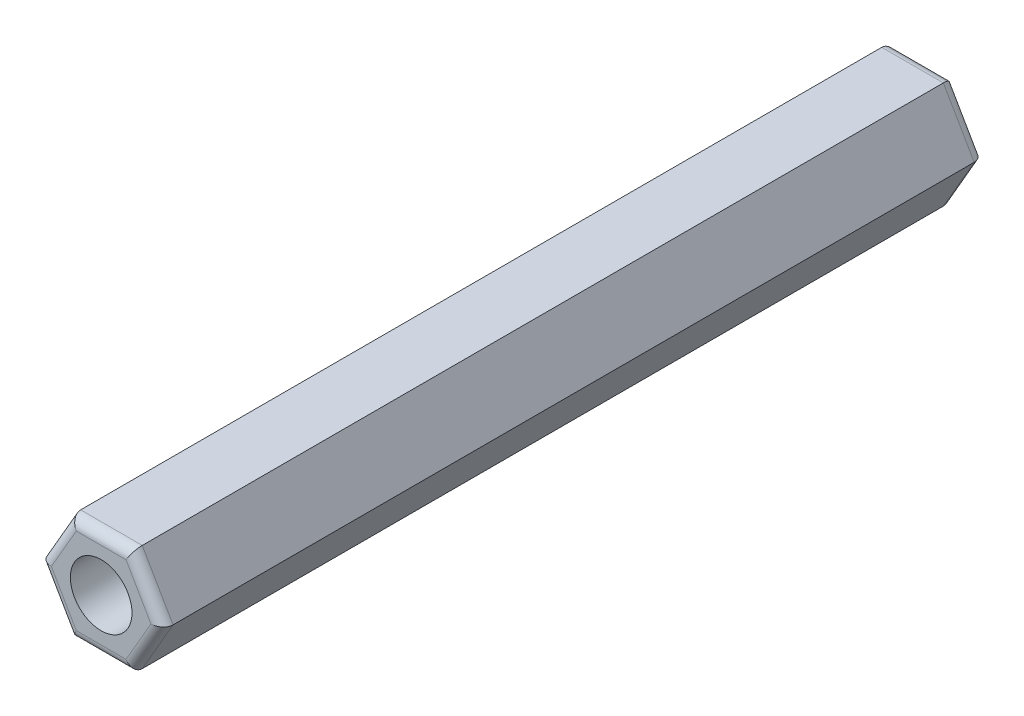
ISO-10303-21;
HEADER;
FILE_DESCRIPTION(('STEP AP214'),'2;1');
FILE_NAME('part.step','',(''),(''),'','','');
FILE_SCHEMA(('AUTOMOTIVE_DESIGN { 1 0 10303 214 1 1 1 1 }'));
ENDSEC;
DATA;
#1=APPLICATION_CONTEXT('core data for automotive mechanical design processes');
#2=APPLICATION_PROTOCOL_DEFINITION('international standard','automotive_design',2000,#1);
#3=PRODUCT_CONTEXT('',#1,'mechanical');
#4=PRODUCT('Part','Part','',(#3));
#5=PRODUCT_RELATED_PRODUCT_CATEGORY('part','',(#4));
#6=PRODUCT_DEFINITION_FORMATION('','',#4);
#7=PRODUCT_DEFINITION_CONTEXT('part definition',#1,'design');
#8=PRODUCT_DEFINITION('design','',#6,#7);
#9=PRODUCT_DEFINITION_SHAPE('','',#8);
#10=(LENGTH_UNIT() NAMED_UNIT(*) SI_UNIT(.MILLI.,.METRE.));
#11=(NAMED_UNIT(*) PLANE_ANGLE_UNIT() SI_UNIT($,.RADIAN.));
#12=(NAMED_UNIT(*) SI_UNIT($,.STERADIAN.) SOLID_ANGLE_UNIT());
#13=UNCERTAINTY_MEASURE_WITH_UNIT(LENGTH_MEASURE(1.E-05),#10,'distance_accuracy_value','');
#14=(GEOMETRIC_REPRESENTATION_CONTEXT(3) GLOBAL_UNCERTAINTY_ASSIGNED_CONTEXT((#13)) GLOBAL_UNIT_ASSIGNED_CONTEXT((#10,
#11,#12)) REPRESENTATION_CONTEXT('',''));
#15=CARTESIAN_POINT('',(0.,0.,0.));
#16=DIRECTION('',(0.,0.,1.));
#17=DIRECTION('',(1.,0.,0.));
#18=AXIS2_PLACEMENT_3D('',#15,#16,#17);
#19=CARTESIAN_POINT('',(1.5,-2.59807621135332,40.));
#20=DIRECTION('',(-0.866025403784439,0.5,0.));
#21=DIRECTION('',(-0.5,-0.866025403784439,0.));
#22=AXIS2_PLACEMENT_3D('',#19,#20,#21);
#23=PLANE('',#22);
#24=DIRECTION('',(0.,0.,-1.));
#25=VECTOR('',#24,1.);
#26=CARTESIAN_POINT('',(1.5,-2.59807621135332,40.));
#27=LINE('',#26,#25);
#28=CARTESIAN_POINT('',(1.5,-2.59807621135332,39.5));
#29=VERTEX_POINT('',#28);
#30=CARTESIAN_POINT('',(1.5,-2.59807621135332,0.5));
#31=VERTEX_POINT('',#30);
#32=EDGE_CURVE('E232',#29,#31,#27,.T.);
#33=ORIENTED_EDGE('',*,*,#32,.T.);
#34=DIRECTION('',(0.5,0.866025403784439,0.));
#35=VECTOR('',#34,1.);
#36=CARTESIAN_POINT('',(1.5,-2.59807621135332,0.5));
#37=LINE('',#36,#35);
#38=CARTESIAN_POINT('',(3.,0.,0.5));
#39=VERTEX_POINT('',#38);
#40=EDGE_CURVE('E133',#31,#39,#37,.T.);
#41=ORIENTED_EDGE('',*,*,#40,.T.);
#42=DIRECTION('',(0.,0.,-1.));
#43=VECTOR('',#42,1.);
#44=CARTESIAN_POINT('',(3.,0.,40.));
#45=LINE('',#44,#43);
#46=CARTESIAN_POINT('',(3.,0.,39.5));
#47=VERTEX_POINT('',#46);
#48=EDGE_CURVE('E153',#47,#39,#45,.T.);
#49=ORIENTED_EDGE('',*,*,#48,.F.);
#50=DIRECTION('',(0.5,0.866025403784439,0.));
#51=VECTOR('',#50,1.);
#52=CARTESIAN_POINT('',(1.5,-2.59807621135332,39.5));
#53=LINE('',#52,#51);
#54=EDGE_CURVE('E200',#47,#29,#53,.F.);
#55=ORIENTED_EDGE('',*,*,#54,.T.);
#56=EDGE_LOOP('',(#33,#41,#49,#55));
#57=FACE_BOUND('',#56,.T.);
#58=ADVANCED_FACE('F33',(#57),#23,.F.);
#59=CARTESIAN_POINT('',(3.,0.,40.));
#60=DIRECTION('',(-0.866025403784439,-0.5,0.));
#61=DIRECTION('',(0.5,-0.866025403784439,0.));
#62=AXIS2_PLACEMENT_3D('',#59,#60,#61);
#63=PLANE('',#62);
#64=ORIENTED_EDGE('',*,*,#48,.T.);
#65=DIRECTION('',(-0.5,0.866025403784439,0.));
#66=VECTOR('',#65,1.);
#67=CARTESIAN_POINT('',(3.,0.,0.5));
#68=LINE('',#67,#66);
#69=CARTESIAN_POINT('',(1.5,2.59807621135332,0.5));
#70=VERTEX_POINT('',#69);
#71=EDGE_CURVE('E203',#39,#70,#68,.T.);
#72=ORIENTED_EDGE('',*,*,#71,.T.);
#73=DIRECTION('',(0.,0.,-1.));
#74=VECTOR('',#73,1.);
#75=CARTESIAN_POINT('',(1.5,2.59807621135332,40.));
#76=LINE('',#75,#74);
#77=CARTESIAN_POINT('',(1.5,2.59807621135332,39.5));
#78=VERTEX_POINT('',#77);
#79=EDGE_CURVE('E227',#78,#70,#76,.T.);
#80=ORIENTED_EDGE('',*,*,#79,.F.);
#81=DIRECTION('',(-0.5,0.866025403784439,0.));
#82=VECTOR('',#81,1.);
#83=CARTESIAN_POINT('',(3.,0.,39.5));
#84=LINE('',#83,#82);
#85=EDGE_CURVE('E205',#78,#47,#84,.F.);
#86=ORIENTED_EDGE('',*,*,#85,.T.);
#87=EDGE_LOOP('',(#64,#72,#80,#86));
#88=FACE_BOUND('',#87,.T.);
#89=ADVANCED_FACE('F271',(#88),#63,.F.);
#90=CARTESIAN_POINT('',(1.5,2.59807621135332,40.));
#91=DIRECTION('',(0.,-1.,0.));
#92=DIRECTION('',(0.,0.,-1.));
#93=AXIS2_PLACEMENT_3D('',#90,#91,#92);
#94=PLANE('',#93);
#95=ORIENTED_EDGE('',*,*,#79,.T.);
#96=DIRECTION('',(-1.,0.,0.));
#97=VECTOR('',#96,1.);
#98=CARTESIAN_POINT('',(1.5,2.59807621135332,0.5));
#99=LINE('',#98,#97);
#100=CARTESIAN_POINT('',(-1.49999999999999,2.59807621135332,0.5));
#101=VERTEX_POINT('',#100);
#102=EDGE_CURVE('E207',#70,#101,#99,.T.);
#103=ORIENTED_EDGE('',*,*,#102,.T.);
#104=DIRECTION('',(0.,0.,-1.));
#105=VECTOR('',#104,1.);
#106=CARTESIAN_POINT('',(-1.49999999999999,2.59807621135332,40.));
#107=LINE('',#106,#105);
#108=CARTESIAN_POINT('',(-1.49999999999999,2.59807621135332,39.5));
#109=VERTEX_POINT('',#108);
#110=EDGE_CURVE('E144',#109,#101,#107,.T.);
#111=ORIENTED_EDGE('',*,*,#110,.F.);
#112=DIRECTION('',(-1.,0.,0.));
#113=VECTOR('',#112,1.);
#114=CARTESIAN_POINT('',(1.5,2.59807621135332,39.5));
#115=LINE('',#114,#113);
#116=EDGE_CURVE('E209',#109,#78,#115,.F.);
#117=ORIENTED_EDGE('',*,*,#116,.T.);
#118=EDGE_LOOP('',(#95,#103,#111,#117));
#119=FACE_BOUND('',#118,.T.);
#120=ADVANCED_FACE('F277',(#119),#94,.F.);
#121=CARTESIAN_POINT('',(-1.49999999999999,2.59807621135332,40.));
#122=DIRECTION('',(0.866025403784439,-0.5,0.));
#123=DIRECTION('',(0.5,0.866025403784439,0.));
#124=AXIS2_PLACEMENT_3D('',#121,#122,#123);
#125=PLANE('',#124);
#126=ORIENTED_EDGE('',*,*,#110,.T.);
#127=DIRECTION('',(-0.5,-0.866025403784439,0.));
#128=VECTOR('',#127,1.);
#129=CARTESIAN_POINT('',(-1.49999999999999,2.59807621135332,0.5));
#130=LINE('',#129,#128);
#131=CARTESIAN_POINT('',(-3.,0.,0.5));
#132=VERTEX_POINT('',#131);
#133=EDGE_CURVE('E143',#101,#132,#130,.T.);
#134=ORIENTED_EDGE('',*,*,#133,.T.);
#135=DIRECTION('',(0.,0.,-1.));
#136=VECTOR('',#135,1.);
#137=CARTESIAN_POINT('',(-3.,0.,40.));
#138=LINE('',#137,#136);
#139=CARTESIAN_POINT('',(-3.,0.,39.5));
#140=VERTEX_POINT('',#139);
#141=EDGE_CURVE('E126',#140,#132,#138,.T.);
#142=ORIENTED_EDGE('',*,*,#141,.F.);
#143=DIRECTION('',(-0.5,-0.866025403784439,0.));
#144=VECTOR('',#143,1.);
#145=CARTESIAN_POINT('',(-1.49999999999999,2.59807621135332,39.5));
#146=LINE('',#145,#144);
#147=EDGE_CURVE('E140',#140,#109,#146,.F.);
#148=ORIENTED_EDGE('',*,*,#147,.T.);
#149=EDGE_LOOP('',(#126,#134,#142,#148));
#150=FACE_BOUND('',#149,.T.);
#151=ADVANCED_FACE('F139',(#150),#125,.F.);
#152=CARTESIAN_POINT('',(-3.,0.,40.));
#153=DIRECTION('',(0.866025403784439,0.5,0.));
#154=DIRECTION('',(-0.5,0.866025403784439,0.));
#155=AXIS2_PLACEMENT_3D('',#152,#153,#154);
#156=PLANE('',#155);
#157=ORIENTED_EDGE('',*,*,#141,.T.);
#158=DIRECTION('',(0.5,-0.866025403784439,0.));
#159=VECTOR('',#158,1.);
#160=CARTESIAN_POINT('',(-3.,0.,0.5));
#161=LINE('',#160,#159);
#162=CARTESIAN_POINT('',(-1.5,-2.59807621135332,0.5));
#163=VERTEX_POINT('',#162);
#164=EDGE_CURVE('E132',#132,#163,#161,.T.);
#165=ORIENTED_EDGE('',*,*,#164,.T.);
#166=DIRECTION('',(0.,0.,-1.));
#167=VECTOR('',#166,1.);
#168=CARTESIAN_POINT('',(-1.5,-2.59807621135332,40.));
#169=LINE('',#168,#167);
#170=CARTESIAN_POINT('',(-1.5,-2.59807621135332,39.5));
#171=VERTEX_POINT('',#170);
#172=EDGE_CURVE('E128',#171,#163,#169,.T.);
#173=ORIENTED_EDGE('',*,*,#172,.F.);
#174=DIRECTION('',(0.5,-0.866025403784439,0.));
#175=VECTOR('',#174,1.);
#176=CARTESIAN_POINT('',(-3.,0.,39.5));
#177=LINE('',#176,#175);
#178=EDGE_CURVE('E123',#171,#140,#177,.F.);
#179=ORIENTED_EDGE('',*,*,#178,.T.);
#180=EDGE_LOOP('',(#157,#165,#173,#179));
#181=FACE_BOUND('',#180,.T.);
#182=ADVANCED_FACE('F125',(#181),#156,.F.);
#183=CARTESIAN_POINT('',(-1.5,-2.59807621135332,40.));
#184=DIRECTION('',(0.,1.,0.));
#185=DIRECTION('',(0.,0.,1.));
#186=AXIS2_PLACEMENT_3D('',#183,#184,#185);
#187=PLANE('',#186);
#188=ORIENTED_EDGE('',*,*,#172,.T.);
#189=DIRECTION('',(1.,0.,0.));
#190=VECTOR('',#189,1.);
#191=CARTESIAN_POINT('',(-1.5,-2.59807621135332,0.5));
#192=LINE('',#191,#190);
#193=EDGE_CURVE('E194',#163,#31,#192,.T.);
#194=ORIENTED_EDGE('',*,*,#193,.T.);
#195=ORIENTED_EDGE('',*,*,#32,.F.);
#196=DIRECTION('',(1.,0.,0.));
#197=VECTOR('',#196,1.);
#198=CARTESIAN_POINT('',(-1.5,-2.59807621135332,39.5));
#199=LINE('',#198,#197);
#200=EDGE_CURVE('E196',#29,#171,#199,.F.);
#201=ORIENTED_EDGE('',*,*,#200,.T.);
#202=EDGE_LOOP('',(#188,#194,#195,#201));
#203=FACE_BOUND('',#202,.T.);
#204=ADVANCED_FACE('F258',(#203),#187,.F.);
#205=CARTESIAN_POINT('',(0.,0.,40.));
#206=DIRECTION('',(0.,0.,1.));
#207=DIRECTION('',(1.,0.,0.));
#208=AXIS2_PLACEMENT_3D('',#205,#206,#207);
#209=PLANE('',#208);
#210=CARTESIAN_POINT('',(0.,0.,40.));
#211=DIRECTION('',(0.,0.,1.));
#212=DIRECTION('',(1.,0.,0.));
#213=AXIS2_PLACEMENT_3D('',#210,#211,#212);
#214=CIRCLE('',#213,1.5);
#215=CARTESIAN_POINT('',(1.5,0.,40.));
#216=VERTEX_POINT('',#215);
#217=EDGE_CURVE('E240',#216,#216,#214,.T.);
#218=ORIENTED_EDGE('',*,*,#217,.F.);
#219=EDGE_LOOP('',(#218));
#220=FACE_BOUND('',#219,.T.);
#221=DIRECTION('',(1.,0.,0.));
#222=VECTOR('',#221,1.);
#223=CARTESIAN_POINT('',(1.5,-2.09807621135332,40.));
#224=LINE('',#223,#222);
#225=CARTESIAN_POINT('',(-1.21132486540518,-2.09807621135332,40.));
#226=VERTEX_POINT('',#225);
#227=CARTESIAN_POINT('',(1.21132486540519,-2.09807621135332,40.));
#228=VERTEX_POINT('',#227);
#229=EDGE_CURVE('E42',#226,#228,#224,.T.);
#230=ORIENTED_EDGE('',*,*,#229,.T.);
#231=DIRECTION('',(0.5,0.866025403784439,0.));
#232=VECTOR('',#231,1.);
#233=CARTESIAN_POINT('',(2.56698729810778,0.25,40.));
#234=LINE('',#233,#232);
#235=CARTESIAN_POINT('',(2.42264973081037,0.,40.));
#236=VERTEX_POINT('',#235);
#237=EDGE_CURVE('E11',#228,#236,#234,.T.);
#238=ORIENTED_EDGE('',*,*,#237,.T.);
#239=DIRECTION('',(-0.5,0.866025403784439,0.));
#240=VECTOR('',#239,1.);
#241=CARTESIAN_POINT('',(1.06698729810778,2.34807621135332,40.));
#242=LINE('',#241,#240);
#243=CARTESIAN_POINT('',(1.21132486540518,2.09807621135332,40.));
#244=VERTEX_POINT('',#243);
#245=EDGE_CURVE('E192',#236,#244,#242,.T.);
#246=ORIENTED_EDGE('',*,*,#245,.T.);
#247=DIRECTION('',(-1.,0.,0.));
#248=VECTOR('',#247,1.);
#249=CARTESIAN_POINT('',(-1.49999999999999,2.09807621135332,40.));
#250=LINE('',#249,#248);
#251=CARTESIAN_POINT('',(-1.21132486540518,2.09807621135332,40.));
#252=VERTEX_POINT('',#251);
#253=EDGE_CURVE('E190',#244,#252,#250,.T.);
#254=ORIENTED_EDGE('',*,*,#253,.T.);
#255=DIRECTION('',(-0.5,-0.866025403784439,0.));
#256=VECTOR('',#255,1.);
#257=CARTESIAN_POINT('',(-2.56698729810778,-0.250000000000003,40.));
#258=LINE('',#257,#256);
#259=CARTESIAN_POINT('',(-2.42264973081037,0.,40.));
#260=VERTEX_POINT('',#259);
#261=EDGE_CURVE('E188',#252,#260,#258,.T.);
#262=ORIENTED_EDGE('',*,*,#261,.T.);
#263=DIRECTION('',(0.5,-0.866025403784439,0.));
#264=VECTOR('',#263,1.);
#265=CARTESIAN_POINT('',(-1.06698729810778,-2.34807621135332,40.));
#266=LINE('',#265,#264);
#267=EDGE_CURVE('E53',#260,#226,#266,.T.);
#268=ORIENTED_EDGE('',*,*,#267,.T.);
#269=EDGE_LOOP('',(#230,#238,#246,#254,#262,#268));
#270=FACE_BOUND('',#269,.T.);
#271=ADVANCED_FACE('F255',(#220,#270),#209,.T.);
#272=CARTESIAN_POINT('',(0.,0.,0.));
#273=DIRECTION('',(0.,0.,1.));
#274=DIRECTION('',(1.,0.,0.));
#275=AXIS2_PLACEMENT_3D('',#272,#273,#274);
#276=PLANE('',#275);
#277=DIRECTION('',(0.5,-0.866025403784439,0.));
#278=VECTOR('',#277,1.);
#279=CARTESIAN_POINT('',(-1.81698729810778,-1.04903810567666,0.));
#280=LINE('',#279,#278);
#281=CARTESIAN_POINT('',(-1.21132486540518,-2.09807621135332,0.));
#282=VERTEX_POINT('',#281);
#283=CARTESIAN_POINT('',(-2.42264973081037,0.,0.));
#284=VERTEX_POINT('',#283);
#285=EDGE_CURVE('E220',#282,#284,#280,.F.);
#286=ORIENTED_EDGE('',*,*,#285,.T.);
#287=DIRECTION('',(-0.5,-0.866025403784439,0.));
#288=VECTOR('',#287,1.);
#289=CARTESIAN_POINT('',(-1.81698729810778,1.04903810567665,0.));
#290=LINE('',#289,#288);
#291=CARTESIAN_POINT('',(-1.21132486540518,2.09807621135332,0.));
#292=VERTEX_POINT('',#291);
#293=EDGE_CURVE('E211',#284,#292,#290,.F.);
#294=ORIENTED_EDGE('',*,*,#293,.T.);
#295=DIRECTION('',(-1.,0.,0.));
#296=VECTOR('',#295,1.);
#297=CARTESIAN_POINT('',(0.,2.09807621135332,0.));
#298=LINE('',#297,#296);
#299=CARTESIAN_POINT('',(1.21132486540519,2.09807621135332,0.));
#300=VERTEX_POINT('',#299);
#301=EDGE_CURVE('E214',#292,#300,#298,.F.);
#302=ORIENTED_EDGE('',*,*,#301,.T.);
#303=DIRECTION('',(-0.5,0.866025403784439,0.));
#304=VECTOR('',#303,1.);
#305=CARTESIAN_POINT('',(1.81698729810778,1.04903810567666,0.));
#306=LINE('',#305,#304);
#307=CARTESIAN_POINT('',(2.42264973081037,0.,0.));
#308=VERTEX_POINT('',#307);
#309=EDGE_CURVE('E216',#300,#308,#306,.F.);
#310=ORIENTED_EDGE('',*,*,#309,.T.);
#311=DIRECTION('',(0.5,0.866025403784439,0.));
#312=VECTOR('',#311,1.);
#313=CARTESIAN_POINT('',(1.81698729810778,-1.04903810567666,0.));
#314=LINE('',#313,#312);
#315=CARTESIAN_POINT('',(1.21132486540519,-2.09807621135332,0.));
#316=VERTEX_POINT('',#315);
#317=EDGE_CURVE('E218',#308,#316,#314,.F.);
#318=ORIENTED_EDGE('',*,*,#317,.T.);
#319=DIRECTION('',(1.,0.,0.));
#320=VECTOR('',#319,1.);
#321=CARTESIAN_POINT('',(0.,-2.09807621135332,0.));
#322=LINE('',#321,#320);
#323=EDGE_CURVE('E222',#316,#282,#322,.F.);
#324=ORIENTED_EDGE('',*,*,#323,.T.);
#325=EDGE_LOOP('',(#286,#294,#302,#310,#318,#324));
#326=FACE_BOUND('',#325,.T.);
#327=CARTESIAN_POINT('',(0.,0.,0.));
#328=DIRECTION('',(0.,0.,-1.));
#329=DIRECTION('',(-1.,0.,0.));
#330=AXIS2_PLACEMENT_3D('',#327,#328,#329);
#331=CIRCLE('',#330,1.75);
#332=CARTESIAN_POINT('',(-1.75,0.,0.));
#333=VERTEX_POINT('',#332);
#334=EDGE_CURVE('E175',#333,#333,#331,.T.);
#335=ORIENTED_EDGE('',*,*,#334,.F.);
#336=EDGE_LOOP('',(#335));
#337=FACE_BOUND('',#336,.T.);
#338=ADVANCED_FACE('F257',(#326,#337),#276,.F.);
#339=CARTESIAN_POINT('',(0.,0.,5.));
#340=DIRECTION('',(0.,0.,-1.));
#341=DIRECTION('',(-1.,0.,0.));
#342=AXIS2_PLACEMENT_3D('',#339,#340,#341);
#343=CYLINDRICAL_SURFACE('',#342,1.75);
#344=CARTESIAN_POINT('',(0.,0.,5.));
#345=DIRECTION('',(0.,0.,-1.));
#346=DIRECTION('',(-1.,0.,0.));
#347=AXIS2_PLACEMENT_3D('',#344,#345,#346);
#348=CIRCLE('',#347,1.75);
#349=CARTESIAN_POINT('',(-1.75,0.,5.));
#350=VERTEX_POINT('',#349);
#351=EDGE_CURVE('E235',#350,#350,#348,.T.);
#352=ORIENTED_EDGE('',*,*,#351,.F.);
#353=EDGE_LOOP('',(#352));
#354=FACE_BOUND('',#353,.T.);
#355=ORIENTED_EDGE('',*,*,#334,.T.);
#356=EDGE_LOOP('',(#355));
#357=FACE_BOUND('',#356,.T.);
#358=ADVANCED_FACE('F264',(#354,#357),#343,.F.);
#359=CARTESIAN_POINT('',(0.,0.,5.));
#360=DIRECTION('',(0.,0.,-1.));
#361=DIRECTION('',(-1.,0.,0.));
#362=AXIS2_PLACEMENT_3D('',#359,#360,#361);
#363=PLANE('',#362);
#364=ORIENTED_EDGE('',*,*,#351,.T.);
#365=EDGE_LOOP('',(#364));
#366=FACE_BOUND('',#365,.T.);
#367=ADVANCED_FACE('F305',(#366),#363,.T.);
#368=CARTESIAN_POINT('',(1.06698729810778,-2.34807621135332,0.5));
#369=DIRECTION('',(0.5,0.866025403784439,0.));
#370=DIRECTION('',(-0.866025403784439,0.5,0.));
#371=AXIS2_PLACEMENT_3D('',#368,#369,#370);
#372=CYLINDRICAL_SURFACE('',#371,0.5);
#373=CARTESIAN_POINT('',(1.21132486540519,-2.09807621135332,0.5));
#374=DIRECTION('',(0.866025403784438,0.5,0.));
#375=DIRECTION('',(0.5,-0.866025403784439,0.));
#376=AXIS2_PLACEMENT_3D('',#373,#374,#375);
#377=ELLIPSE('',#376,0.577350269189626,0.5);
#378=EDGE_CURVE('E176',#316,#31,#377,.F.);
#379=ORIENTED_EDGE('',*,*,#378,.F.);
#380=ORIENTED_EDGE('',*,*,#317,.F.);
#381=CARTESIAN_POINT('',(2.42264973081037,0.,0.5));
#382=DIRECTION('',(0.,1.,0.));
#383=DIRECTION('',(1.,0.,0.));
#384=AXIS2_PLACEMENT_3D('',#381,#382,#383);
#385=ELLIPSE('',#384,0.577350269189626,0.5);
#386=EDGE_CURVE('E172',#39,#308,#385,.T.);
#387=ORIENTED_EDGE('',*,*,#386,.F.);
#388=ORIENTED_EDGE('',*,*,#40,.F.);
#389=EDGE_LOOP('',(#379,#380,#387,#388));
#390=FACE_BOUND('',#389,.T.);
#391=ADVANCED_FACE('F301',(#390),#372,.T.);
#392=CARTESIAN_POINT('',(2.56698729810778,-0.25,0.5));
#393=DIRECTION('',(-0.5,0.866025403784439,0.));
#394=DIRECTION('',(-0.866025403784439,-0.5,0.));
#395=AXIS2_PLACEMENT_3D('',#392,#393,#394);
#396=CYLINDRICAL_SURFACE('',#395,0.5);
#397=ORIENTED_EDGE('',*,*,#386,.T.);
#398=ORIENTED_EDGE('',*,*,#309,.F.);
#399=CARTESIAN_POINT('',(1.21132486540519,2.09807621135332,0.5));
#400=DIRECTION('',(-0.866025403784439,0.5,0.));
#401=DIRECTION('',(0.5,0.866025403784439,0.));
#402=AXIS2_PLACEMENT_3D('',#399,#400,#401);
#403=ELLIPSE('',#402,0.577350269189626,0.5);
#404=EDGE_CURVE('E179',#70,#300,#403,.T.);
#405=ORIENTED_EDGE('',*,*,#404,.F.);
#406=ORIENTED_EDGE('',*,*,#71,.F.);
#407=EDGE_LOOP('',(#397,#398,#405,#406));
#408=FACE_BOUND('',#407,.T.);
#409=ADVANCED_FACE('F297',(#408),#396,.T.);
#410=CARTESIAN_POINT('',(-1.5,-2.09807621135332,0.5));
#411=DIRECTION('',(1.,0.,0.));
#412=DIRECTION('',(0.,0.,-1.));
#413=AXIS2_PLACEMENT_3D('',#410,#411,#412);
#414=CYLINDRICAL_SURFACE('',#413,0.5);
#415=ORIENTED_EDGE('',*,*,#378,.T.);
#416=ORIENTED_EDGE('',*,*,#193,.F.);
#417=CARTESIAN_POINT('',(-1.21132486540518,-2.09807621135332,0.5));
#418=DIRECTION('',(0.866025403784439,-0.5,0.));
#419=DIRECTION('',(0.5,0.866025403784439,0.));
#420=AXIS2_PLACEMENT_3D('',#417,#418,#419);
#421=ELLIPSE('',#420,0.577350269189626,0.5);
#422=EDGE_CURVE('E182',#282,#163,#421,.F.);
#423=ORIENTED_EDGE('',*,*,#422,.F.);
#424=ORIENTED_EDGE('',*,*,#323,.F.);
#425=EDGE_LOOP('',(#415,#416,#423,#424));
#426=FACE_BOUND('',#425,.T.);
#427=ADVANCED_FACE('F293',(#426),#414,.T.);
#428=CARTESIAN_POINT('',(1.5,2.09807621135332,0.5));
#429=DIRECTION('',(-1.,0.,0.));
#430=DIRECTION('',(0.,0.,1.));
#431=AXIS2_PLACEMENT_3D('',#428,#429,#430);
#432=CYLINDRICAL_SURFACE('',#431,0.5);
#433=ORIENTED_EDGE('',*,*,#404,.T.);
#434=ORIENTED_EDGE('',*,*,#301,.F.);
#435=CARTESIAN_POINT('',(-1.21132486540518,2.09807621135332,0.5));
#436=DIRECTION('',(-0.866025403784438,-0.5,0.));
#437=DIRECTION('',(-0.5,0.866025403784439,0.));
#438=AXIS2_PLACEMENT_3D('',#435,#436,#437);
#439=ELLIPSE('',#438,0.577350269189626,0.5);
#440=EDGE_CURVE('E157',#101,#292,#439,.T.);
#441=ORIENTED_EDGE('',*,*,#440,.F.);
#442=ORIENTED_EDGE('',*,*,#102,.F.);
#443=EDGE_LOOP('',(#433,#434,#441,#442));
#444=FACE_BOUND('',#443,.T.);
#445=ADVANCED_FACE('F289',(#444),#432,.T.);
#446=CARTESIAN_POINT('',(-2.56698729810778,0.249999999999996,0.5));
#447=DIRECTION('',(0.5,-0.866025403784439,0.));
#448=DIRECTION('',(0.866025403784439,0.5,0.));
#449=AXIS2_PLACEMENT_3D('',#446,#447,#448);
#450=CYLINDRICAL_SURFACE('',#449,0.5);
#451=ORIENTED_EDGE('',*,*,#422,.T.);
#452=ORIENTED_EDGE('',*,*,#164,.F.);
#453=CARTESIAN_POINT('',(-2.42264973081037,0.,0.5));
#454=DIRECTION('',(0.,-1.,0.));
#455=DIRECTION('',(1.,0.,0.));
#456=AXIS2_PLACEMENT_3D('',#453,#454,#455);
#457=ELLIPSE('',#456,0.577350269189626,0.5);
#458=EDGE_CURVE('E156',#284,#132,#457,.F.);
#459=ORIENTED_EDGE('',*,*,#458,.F.);
#460=ORIENTED_EDGE('',*,*,#285,.F.);
#461=EDGE_LOOP('',(#451,#452,#459,#460));
#462=FACE_BOUND('',#461,.T.);
#463=ADVANCED_FACE('F285',(#462),#450,.T.);
#464=CARTESIAN_POINT('',(-1.06698729810778,2.34807621135332,0.5));
#465=DIRECTION('',(-0.5,-0.866025403784439,0.));
#466=DIRECTION('',(0.866025403784439,-0.5,0.));
#467=AXIS2_PLACEMENT_3D('',#464,#465,#466);
#468=CYLINDRICAL_SURFACE('',#467,0.5);
#469=ORIENTED_EDGE('',*,*,#440,.T.);
#470=ORIENTED_EDGE('',*,*,#293,.F.);
#471=ORIENTED_EDGE('',*,*,#458,.T.);
#472=ORIENTED_EDGE('',*,*,#133,.F.);
#473=EDGE_LOOP('',(#469,#470,#471,#472));
#474=FACE_BOUND('',#473,.T.);
#475=ADVANCED_FACE('F282',(#474),#468,.T.);
#476=CARTESIAN_POINT('',(-1.81698729810778,1.04903810567665,39.5));
#477=DIRECTION('',(0.5,0.866025403784439,0.));
#478=DIRECTION('',(-0.866025403784439,0.5,0.));
#479=AXIS2_PLACEMENT_3D('',#476,#477,#478);
#480=CYLINDRICAL_SURFACE('',#479,0.5);
#481=CARTESIAN_POINT('',(-1.21132486540518,2.09807621135332,39.5));
#482=DIRECTION('',(0.866025403784438,0.5,0.));
#483=DIRECTION('',(0.5,-0.866025403784439,0.));
#484=AXIS2_PLACEMENT_3D('',#481,#482,#483);
#485=ELLIPSE('',#484,0.577350269189626,0.5);
#486=EDGE_CURVE('E151',#109,#252,#485,.T.);
#487=ORIENTED_EDGE('',*,*,#486,.F.);
#488=ORIENTED_EDGE('',*,*,#147,.F.);
#489=CARTESIAN_POINT('',(-2.42264973081037,0.,39.5));
#490=DIRECTION('',(0.,1.,0.));
#491=DIRECTION('',(1.,0.,0.));
#492=AXIS2_PLACEMENT_3D('',#489,#490,#491);
#493=ELLIPSE('',#492,0.577350269189626,0.5);
#494=EDGE_CURVE('E37',#260,#140,#493,.F.);
#495=ORIENTED_EDGE('',*,*,#494,.F.);
#496=ORIENTED_EDGE('',*,*,#261,.F.);
#497=EDGE_LOOP('',(#487,#488,#495,#496));
#498=FACE_BOUND('',#497,.T.);
#499=ADVANCED_FACE('F35',(#498),#480,.T.);
#500=CARTESIAN_POINT('',(-1.81698729810778,-1.04903810567666,39.5));
#501=DIRECTION('',(-0.5,0.866025403784439,0.));
#502=DIRECTION('',(-0.866025403784439,-0.5,0.));
#503=AXIS2_PLACEMENT_3D('',#500,#501,#502);
#504=CYLINDRICAL_SURFACE('',#503,0.5);
#505=ORIENTED_EDGE('',*,*,#494,.T.);
#506=ORIENTED_EDGE('',*,*,#178,.F.);
#507=CARTESIAN_POINT('',(-1.21132486540518,-2.09807621135332,39.5));
#508=DIRECTION('',(-0.866025403784439,0.5,0.));
#509=DIRECTION('',(0.5,0.866025403784439,0.));
#510=AXIS2_PLACEMENT_3D('',#507,#508,#509);
#511=ELLIPSE('',#510,0.577350269189626,0.5);
#512=EDGE_CURVE('E159',#226,#171,#511,.F.);
#513=ORIENTED_EDGE('',*,*,#512,.F.);
#514=ORIENTED_EDGE('',*,*,#267,.F.);
#515=EDGE_LOOP('',(#505,#506,#513,#514));
#516=FACE_BOUND('',#515,.T.);
#517=ADVANCED_FACE('F155',(#516),#504,.T.);
#518=CARTESIAN_POINT('',(0.,2.09807621135332,39.5));
#519=DIRECTION('',(1.,0.,0.));
#520=DIRECTION('',(0.,0.,-1.));
#521=AXIS2_PLACEMENT_3D('',#518,#519,#520);
#522=CYLINDRICAL_SURFACE('',#521,0.5);
#523=ORIENTED_EDGE('',*,*,#486,.T.);
#524=ORIENTED_EDGE('',*,*,#253,.F.);
#525=CARTESIAN_POINT('',(1.21132486540518,2.09807621135332,39.5));
#526=DIRECTION('',(0.866025403784439,-0.5,0.));
#527=DIRECTION('',(-0.5,-0.866025403784439,0.));
#528=AXIS2_PLACEMENT_3D('',#525,#526,#527);
#529=ELLIPSE('',#528,0.577350269189626,0.5);
#530=EDGE_CURVE('E162',#78,#244,#529,.T.);
#531=ORIENTED_EDGE('',*,*,#530,.F.);
#532=ORIENTED_EDGE('',*,*,#116,.F.);
#533=EDGE_LOOP('',(#523,#524,#531,#532));
#534=FACE_BOUND('',#533,.T.);
#535=ADVANCED_FACE('F317',(#534),#522,.T.);
#536=CARTESIAN_POINT('',(0.,-2.09807621135332,39.5));
#537=DIRECTION('',(-1.,0.,0.));
#538=DIRECTION('',(0.,0.,1.));
#539=AXIS2_PLACEMENT_3D('',#536,#537,#538);
#540=CYLINDRICAL_SURFACE('',#539,0.5);
#541=ORIENTED_EDGE('',*,*,#512,.T.);
#542=ORIENTED_EDGE('',*,*,#200,.F.);
#543=CARTESIAN_POINT('',(1.21132486540519,-2.09807621135332,39.5));
#544=DIRECTION('',(-0.866025403784438,-0.5,0.));
#545=DIRECTION('',(-0.5,0.866025403784439,0.));
#546=AXIS2_PLACEMENT_3D('',#543,#544,#545);
#547=ELLIPSE('',#546,0.577350269189626,0.5);
#548=EDGE_CURVE('E167',#228,#29,#547,.F.);
#549=ORIENTED_EDGE('',*,*,#548,.F.);
#550=ORIENTED_EDGE('',*,*,#229,.F.);
#551=EDGE_LOOP('',(#541,#542,#549,#550));
#552=FACE_BOUND('',#551,.T.);
#553=ADVANCED_FACE('F313',(#552),#540,.T.);
#554=CARTESIAN_POINT('',(1.81698729810778,1.04903810567666,39.5));
#555=DIRECTION('',(0.5,-0.866025403784439,0.));
#556=DIRECTION('',(0.866025403784439,0.5,0.));
#557=AXIS2_PLACEMENT_3D('',#554,#555,#556);
#558=CYLINDRICAL_SURFACE('',#557,0.5);
#559=ORIENTED_EDGE('',*,*,#530,.T.);
#560=ORIENTED_EDGE('',*,*,#245,.F.);
#561=CARTESIAN_POINT('',(2.42264973081037,0.,39.5));
#562=DIRECTION('',(0.,-1.,0.));
#563=DIRECTION('',(1.,0.,0.));
#564=AXIS2_PLACEMENT_3D('',#561,#562,#563);
#565=ELLIPSE('',#564,0.577350269189626,0.5);
#566=EDGE_CURVE('E169',#47,#236,#565,.T.);
#567=ORIENTED_EDGE('',*,*,#566,.F.);
#568=ORIENTED_EDGE('',*,*,#85,.F.);
#569=EDGE_LOOP('',(#559,#560,#567,#568));
#570=FACE_BOUND('',#569,.T.);
#571=ADVANCED_FACE('F309',(#570),#558,.T.);
#572=CARTESIAN_POINT('',(1.81698729810778,-1.04903810567666,39.5));
#573=DIRECTION('',(-0.5,-0.866025403784439,0.));
#574=DIRECTION('',(0.866025403784439,-0.5,0.));
#575=AXIS2_PLACEMENT_3D('',#572,#573,#574);
#576=CYLINDRICAL_SURFACE('',#575,0.5);
#577=ORIENTED_EDGE('',*,*,#548,.T.);
#578=ORIENTED_EDGE('',*,*,#54,.F.);
#579=ORIENTED_EDGE('',*,*,#566,.T.);
#580=ORIENTED_EDGE('',*,*,#237,.F.);
#581=EDGE_LOOP('',(#577,#578,#579,#580));
#582=FACE_BOUND('',#581,.T.);
#583=ADVANCED_FACE('F251',(#582),#576,.T.);
#584=CARTESIAN_POINT('',(0.,0.,35.));
#585=DIRECTION('',(0.,0.,1.));
#586=DIRECTION('',(1.,0.,0.));
#587=AXIS2_PLACEMENT_3D('',#584,#585,#586);
#588=CYLINDRICAL_SURFACE('',#587,1.5);
#589=CARTESIAN_POINT('',(0.,0.,35.));
#590=DIRECTION('',(0.,0.,1.));
#591=DIRECTION('',(1.,0.,0.));
#592=AXIS2_PLACEMENT_3D('',#589,#590,#591);
#593=CIRCLE('',#592,1.5);
#594=CARTESIAN_POINT('',(1.5,0.,35.));
#595=VERTEX_POINT('',#594);
#596=EDGE_CURVE('E171',#595,#595,#593,.T.);
#597=ORIENTED_EDGE('',*,*,#596,.F.);
#598=EDGE_LOOP('',(#597));
#599=FACE_BOUND('',#598,.T.);
#600=ORIENTED_EDGE('',*,*,#217,.T.);
#601=EDGE_LOOP('',(#600));
#602=FACE_BOUND('',#601,.T.);
#603=ADVANCED_FACE('F248',(#599,#602),#588,.F.);
#604=CARTESIAN_POINT('',(0.,0.,35.));
#605=DIRECTION('',(0.,0.,1.));
#606=DIRECTION('',(1.,0.,0.));
#607=AXIS2_PLACEMENT_3D('',#604,#605,#606);
#608=PLANE('',#607);
#609=ORIENTED_EDGE('',*,*,#596,.T.);
#610=EDGE_LOOP('',(#609));
#611=FACE_BOUND('',#610,.T.);
#612=ADVANCED_FACE('F246',(#611),#608,.T.);
#613=CLOSED_SHELL('',(#58,#89,#120,#151,#182,#204,#271,#338,#358,#367,#391,#409,#427,#445,#463,
#475,#499,#517,#535,#553,#571,#583,#603,#612));
#614=MANIFOLD_SOLID_BREP('B2',#613);
#615=ADVANCED_BREP_SHAPE_REPRESENTATION('',(#18,#614),#14);
#616=SHAPE_DEFINITION_REPRESENTATION(#9,#615);
ENDSEC;
END-ISO-10303-21;
